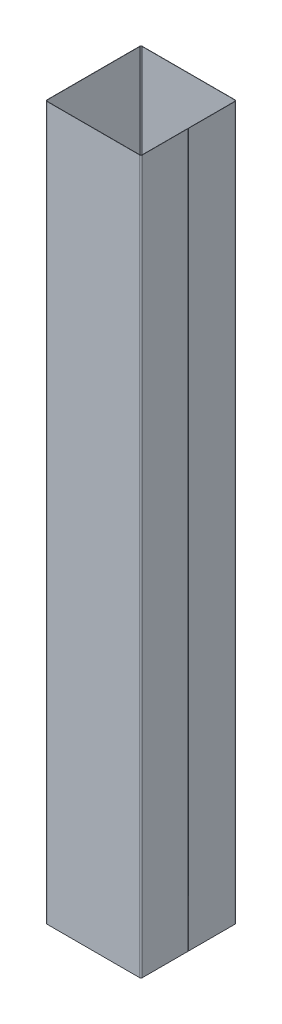
ISO-10303-21;
HEADER;
FILE_DESCRIPTION(('STEP AP214'),'2;1');
FILE_NAME('part.step','',(''),(''),'','','');
FILE_SCHEMA(('AUTOMOTIVE_DESIGN { 1 0 10303 214 1 1 1 1 }'));
ENDSEC;
DATA;
#1=APPLICATION_CONTEXT('core data for automotive mechanical design processes');
#2=APPLICATION_PROTOCOL_DEFINITION('international standard','automotive_design',2000,#1);
#3=PRODUCT_CONTEXT('',#1,'mechanical');
#4=PRODUCT('Part','Part','',(#3));
#5=PRODUCT_RELATED_PRODUCT_CATEGORY('part','',(#4));
#6=PRODUCT_DEFINITION_FORMATION('','',#4);
#7=PRODUCT_DEFINITION_CONTEXT('part definition',#1,'design');
#8=PRODUCT_DEFINITION('design','',#6,#7);
#9=PRODUCT_DEFINITION_SHAPE('','',#8);
#10=(LENGTH_UNIT() NAMED_UNIT(*) SI_UNIT(.MILLI.,.METRE.));
#11=(NAMED_UNIT(*) PLANE_ANGLE_UNIT() SI_UNIT($,.RADIAN.));
#12=(NAMED_UNIT(*) SI_UNIT($,.STERADIAN.) SOLID_ANGLE_UNIT());
#13=UNCERTAINTY_MEASURE_WITH_UNIT(LENGTH_MEASURE(1.E-05),#10,'distance_accuracy_value','');
#14=(GEOMETRIC_REPRESENTATION_CONTEXT(3) GLOBAL_UNCERTAINTY_ASSIGNED_CONTEXT((#13)) GLOBAL_UNIT_ASSIGNED_CONTEXT((#10,
#11,#12)) REPRESENTATION_CONTEXT('',''));
#15=CARTESIAN_POINT('',(0.,0.,0.));
#16=DIRECTION('',(0.,0.,1.));
#17=DIRECTION('',(1.,0.,0.));
#18=AXIS2_PLACEMENT_3D('',#15,#16,#17);
#19=CARTESIAN_POINT('',(39.,600.,-40.));
#20=DIRECTION('',(0.,1.,0.));
#21=DIRECTION('',(0.,0.,1.));
#22=AXIS2_PLACEMENT_3D('',#19,#20,#21);
#23=PLANE('',#22);
#24=DIRECTION('',(0.,0.,-1.));
#25=VECTOR('',#24,1.);
#26=CARTESIAN_POINT('',(39.,600.,-40.));
#27=LINE('',#26,#25);
#28=CARTESIAN_POINT('',(39.,600.,-40.));
#29=VERTEX_POINT('',#28);
#30=CARTESIAN_POINT('',(39.,600.,-40.2));
#31=VERTEX_POINT('',#30);
#32=EDGE_CURVE('E11',#29,#31,#27,.T.);
#33=ORIENTED_EDGE('',*,*,#32,.F.);
#34=CARTESIAN_POINT('',(39.,600.,-39.));
#35=DIRECTION('',(0.,-1.,0.));
#36=DIRECTION('',(0.,0.,-1.));
#37=AXIS2_PLACEMENT_3D('',#34,#35,#36);
#38=CIRCLE('',#37,1.);
#39=CARTESIAN_POINT('',(40.,600.,-39.));
#40=VERTEX_POINT('',#39);
#41=EDGE_CURVE('E219',#29,#40,#38,.T.);
#42=ORIENTED_EDGE('',*,*,#41,.T.);
#43=DIRECTION('',(-1.,0.,0.));
#44=VECTOR('',#43,1.);
#45=CARTESIAN_POINT('',(40.2,600.,-39.));
#46=LINE('',#45,#44);
#47=CARTESIAN_POINT('',(40.2,600.,-39.));
#48=VERTEX_POINT('',#47);
#49=EDGE_CURVE('E46',#48,#40,#46,.T.);
#50=ORIENTED_EDGE('',*,*,#49,.F.);
#51=CARTESIAN_POINT('',(39.,600.,-39.));
#52=DIRECTION('',(0.,1.,0.));
#53=DIRECTION('',(1.,0.,0.));
#54=AXIS2_PLACEMENT_3D('',#51,#52,#53);
#55=CIRCLE('',#54,1.2);
#56=EDGE_CURVE('E359',#31,#48,#55,.F.);
#57=ORIENTED_EDGE('',*,*,#56,.F.);
#58=EDGE_LOOP('',(#33,#42,#50,#57));
#59=FACE_BOUND('',#58,.T.);
#60=ADVANCED_FACE('F38',(#59),#23,.T.);
#61=CARTESIAN_POINT('',(40.2,600.,-39.));
#62=DIRECTION('',(0.,1.,0.));
#63=DIRECTION('',(0.,0.,1.));
#64=AXIS2_PLACEMENT_3D('',#61,#62,#63);
#65=PLANE('',#64);
#66=DIRECTION('',(1.,0.,0.));
#67=VECTOR('',#66,1.);
#68=CARTESIAN_POINT('',(-40.,600.,-40.));
#69=LINE('',#68,#67);
#70=CARTESIAN_POINT('',(-39.,600.,-40.));
#71=VERTEX_POINT('',#70);
#72=EDGE_CURVE('E186',#71,#29,#69,.T.);
#73=ORIENTED_EDGE('',*,*,#72,.T.);
#74=ORIENTED_EDGE('',*,*,#32,.T.);
#75=DIRECTION('',(1.,0.,0.));
#76=VECTOR('',#75,1.);
#77=CARTESIAN_POINT('',(-40.,600.,-40.2));
#78=LINE('',#77,#76);
#79=CARTESIAN_POINT('',(-39.,600.,-40.2));
#80=VERTEX_POINT('',#79);
#81=EDGE_CURVE('E189',#80,#31,#78,.T.);
#82=ORIENTED_EDGE('',*,*,#81,.F.);
#83=DIRECTION('',(0.,0.,1.));
#84=VECTOR('',#83,1.);
#85=CARTESIAN_POINT('',(-39.,600.,-40.2));
#86=LINE('',#85,#84);
#87=EDGE_CURVE('E182',#80,#71,#86,.T.);
#88=ORIENTED_EDGE('',*,*,#87,.T.);
#89=EDGE_LOOP('',(#73,#74,#82,#88));
#90=FACE_BOUND('',#89,.T.);
#91=ADVANCED_FACE('F184',(#90),#65,.T.);
#92=CARTESIAN_POINT('',(40.,0.,-39.));
#93=DIRECTION('',(0.,-1.,0.));
#94=DIRECTION('',(0.,0.,-1.));
#95=AXIS2_PLACEMENT_3D('',#92,#93,#94);
#96=PLANE('',#95);
#97=DIRECTION('',(1.,0.,0.));
#98=VECTOR('',#97,1.);
#99=CARTESIAN_POINT('',(40.,0.,-39.));
#100=LINE('',#99,#98);
#101=CARTESIAN_POINT('',(40.,0.,-39.));
#102=VERTEX_POINT('',#101);
#103=CARTESIAN_POINT('',(40.2,0.,-39.));
#104=VERTEX_POINT('',#103);
#105=EDGE_CURVE('E125',#102,#104,#100,.T.);
#106=ORIENTED_EDGE('',*,*,#105,.F.);
#107=CARTESIAN_POINT('',(39.,0.,-39.));
#108=DIRECTION('',(0.,-1.,0.));
#109=DIRECTION('',(0.,0.,-1.));
#110=AXIS2_PLACEMENT_3D('',#107,#108,#109);
#111=CIRCLE('',#110,1.);
#112=CARTESIAN_POINT('',(39.,0.,-40.));
#113=VERTEX_POINT('',#112);
#114=EDGE_CURVE('E277',#113,#102,#111,.T.);
#115=ORIENTED_EDGE('',*,*,#114,.F.);
#116=DIRECTION('',(0.,0.,1.));
#117=VECTOR('',#116,1.);
#118=CARTESIAN_POINT('',(39.,0.,-40.2));
#119=LINE('',#118,#117);
#120=CARTESIAN_POINT('',(39.,0.,-40.2));
#121=VERTEX_POINT('',#120);
#122=EDGE_CURVE('E118',#121,#113,#119,.T.);
#123=ORIENTED_EDGE('',*,*,#122,.F.);
#124=CARTESIAN_POINT('',(39.,0.,-39.));
#125=DIRECTION('',(0.,1.,0.));
#126=DIRECTION('',(1.,0.,0.));
#127=AXIS2_PLACEMENT_3D('',#124,#125,#126);
#128=CIRCLE('',#127,1.2);
#129=EDGE_CURVE('E234',#121,#104,#128,.F.);
#130=ORIENTED_EDGE('',*,*,#129,.T.);
#131=EDGE_LOOP('',(#106,#115,#123,#130));
#132=FACE_BOUND('',#131,.T.);
#133=ADVANCED_FACE('F364',(#132),#96,.T.);
#134=CARTESIAN_POINT('',(39.,0.,-40.2));
#135=DIRECTION('',(0.,-1.,0.));
#136=DIRECTION('',(0.,0.,-1.));
#137=AXIS2_PLACEMENT_3D('',#134,#135,#136);
#138=PLANE('',#137);
#139=DIRECTION('',(0.,0.,1.));
#140=VECTOR('',#139,1.);
#141=CARTESIAN_POINT('',(40.,0.,-40.));
#142=LINE('',#141,#140);
#143=CARTESIAN_POINT('',(40.,0.,0.));
#144=VERTEX_POINT('',#143);
#145=EDGE_CURVE('E225',#102,#144,#142,.T.);
#146=ORIENTED_EDGE('',*,*,#145,.F.);
#147=ORIENTED_EDGE('',*,*,#105,.T.);
#148=DIRECTION('',(0.,0.,-1.));
#149=VECTOR('',#148,1.);
#150=CARTESIAN_POINT('',(40.2,0.,-40.));
#151=LINE('',#150,#149);
#152=CARTESIAN_POINT('',(40.2,0.,0.));
#153=VERTEX_POINT('',#152);
#154=EDGE_CURVE('E231',#104,#153,#151,.F.);
#155=ORIENTED_EDGE('',*,*,#154,.T.);
#156=DIRECTION('',(-1.,0.,0.));
#157=VECTOR('',#156,1.);
#158=CARTESIAN_POINT('',(40.2,0.,0.));
#159=LINE('',#158,#157);
#160=EDGE_CURVE('E228',#153,#144,#159,.T.);
#161=ORIENTED_EDGE('',*,*,#160,.T.);
#162=EDGE_LOOP('',(#146,#147,#155,#161));
#163=FACE_BOUND('',#162,.T.);
#164=ADVANCED_FACE('F350',(#163),#138,.T.);
#165=CARTESIAN_POINT('',(-40.,600.,-39.));
#166=DIRECTION('',(0.,1.,0.));
#167=DIRECTION('',(0.,0.,1.));
#168=AXIS2_PLACEMENT_3D('',#165,#166,#167);
#169=PLANE('',#168);
#170=DIRECTION('',(-1.,0.,0.));
#171=VECTOR('',#170,1.);
#172=CARTESIAN_POINT('',(-40.,600.,-39.));
#173=LINE('',#172,#171);
#174=CARTESIAN_POINT('',(-40.,600.,-39.));
#175=VERTEX_POINT('',#174);
#176=CARTESIAN_POINT('',(-40.2,600.,-39.));
#177=VERTEX_POINT('',#176);
#178=EDGE_CURVE('E194',#175,#177,#173,.T.);
#179=ORIENTED_EDGE('',*,*,#178,.F.);
#180=CARTESIAN_POINT('',(-39.,600.,-39.));
#181=DIRECTION('',(0.,-1.,0.));
#182=DIRECTION('',(0.,0.,-1.));
#183=AXIS2_PLACEMENT_3D('',#180,#181,#182);
#184=CIRCLE('',#183,1.);
#185=EDGE_CURVE('E198',#175,#71,#184,.T.);
#186=ORIENTED_EDGE('',*,*,#185,.T.);
#187=ORIENTED_EDGE('',*,*,#87,.F.);
#188=CARTESIAN_POINT('',(-39.,600.,-39.));
#189=DIRECTION('',(0.,1.,0.));
#190=DIRECTION('',(1.,0.,0.));
#191=AXIS2_PLACEMENT_3D('',#188,#189,#190);
#192=CIRCLE('',#191,1.2);
#193=EDGE_CURVE('E371',#177,#80,#192,.F.);
#194=ORIENTED_EDGE('',*,*,#193,.F.);
#195=EDGE_LOOP('',(#179,#186,#187,#194));
#196=FACE_BOUND('',#195,.T.);
#197=ADVANCED_FACE('F200',(#196),#169,.T.);
#198=CARTESIAN_POINT('',(-39.,600.,-40.2));
#199=DIRECTION('',(0.,1.,0.));
#200=DIRECTION('',(0.,0.,1.));
#201=AXIS2_PLACEMENT_3D('',#198,#199,#200);
#202=PLANE('',#201);
#203=DIRECTION('',(0.,0.,-1.));
#204=VECTOR('',#203,1.);
#205=CARTESIAN_POINT('',(-40.,600.,-40.));
#206=LINE('',#205,#204);
#207=CARTESIAN_POINT('',(-40.,600.,39.));
#208=VERTEX_POINT('',#207);
#209=EDGE_CURVE('E204',#208,#175,#206,.T.);
#210=ORIENTED_EDGE('',*,*,#209,.T.);
#211=ORIENTED_EDGE('',*,*,#178,.T.);
#212=DIRECTION('',(0.,0.,-1.));
#213=VECTOR('',#212,1.);
#214=CARTESIAN_POINT('',(-40.2,600.,-40.));
#215=LINE('',#214,#213);
#216=CARTESIAN_POINT('',(-40.2,600.,39.));
#217=VERTEX_POINT('',#216);
#218=EDGE_CURVE('E378',#217,#177,#215,.T.);
#219=ORIENTED_EDGE('',*,*,#218,.F.);
#220=DIRECTION('',(1.,0.,0.));
#221=VECTOR('',#220,1.);
#222=CARTESIAN_POINT('',(-40.2,600.,39.));
#223=LINE('',#222,#221);
#224=EDGE_CURVE('E339',#217,#208,#223,.T.);
#225=ORIENTED_EDGE('',*,*,#224,.T.);
#226=EDGE_LOOP('',(#210,#211,#219,#225));
#227=FACE_BOUND('',#226,.T.);
#228=ADVANCED_FACE('F410',(#227),#202,.T.);
#229=CARTESIAN_POINT('',(-39.,0.,-40.));
#230=DIRECTION('',(0.,-1.,0.));
#231=DIRECTION('',(0.,0.,-1.));
#232=AXIS2_PLACEMENT_3D('',#229,#230,#231);
#233=PLANE('',#232);
#234=DIRECTION('',(0.,0.,-1.));
#235=VECTOR('',#234,1.);
#236=CARTESIAN_POINT('',(-39.,0.,-40.));
#237=LINE('',#236,#235);
#238=CARTESIAN_POINT('',(-39.,0.,-40.));
#239=VERTEX_POINT('',#238);
#240=CARTESIAN_POINT('',(-39.,0.,-40.2));
#241=VERTEX_POINT('',#240);
#242=EDGE_CURVE('E195',#239,#241,#237,.T.);
#243=ORIENTED_EDGE('',*,*,#242,.F.);
#244=CARTESIAN_POINT('',(-39.,0.,-39.));
#245=DIRECTION('',(0.,-1.,0.));
#246=DIRECTION('',(0.,0.,-1.));
#247=AXIS2_PLACEMENT_3D('',#244,#245,#246);
#248=CIRCLE('',#247,1.);
#249=CARTESIAN_POINT('',(-40.,0.,-39.));
#250=VERTEX_POINT('',#249);
#251=EDGE_CURVE('E211',#250,#239,#248,.T.);
#252=ORIENTED_EDGE('',*,*,#251,.F.);
#253=DIRECTION('',(1.,0.,0.));
#254=VECTOR('',#253,1.);
#255=CARTESIAN_POINT('',(-40.2,0.,-39.));
#256=LINE('',#255,#254);
#257=CARTESIAN_POINT('',(-40.2,0.,-39.));
#258=VERTEX_POINT('',#257);
#259=EDGE_CURVE('E343',#258,#250,#256,.T.);
#260=ORIENTED_EDGE('',*,*,#259,.F.);
#261=CARTESIAN_POINT('',(-39.,0.,-39.));
#262=DIRECTION('',(0.,1.,0.));
#263=DIRECTION('',(1.,0.,0.));
#264=AXIS2_PLACEMENT_3D('',#261,#262,#263);
#265=CIRCLE('',#264,1.2);
#266=EDGE_CURVE('E238',#258,#241,#265,.F.);
#267=ORIENTED_EDGE('',*,*,#266,.T.);
#268=EDGE_LOOP('',(#243,#252,#260,#267));
#269=FACE_BOUND('',#268,.T.);
#270=ADVANCED_FACE('F417',(#269),#233,.T.);
#271=CARTESIAN_POINT('',(-40.2,0.,-39.));
#272=DIRECTION('',(0.,-1.,0.));
#273=DIRECTION('',(0.,0.,-1.));
#274=AXIS2_PLACEMENT_3D('',#271,#272,#273);
#275=PLANE('',#274);
#276=DIRECTION('',(1.,0.,0.));
#277=VECTOR('',#276,1.);
#278=CARTESIAN_POINT('',(-40.,0.,-40.));
#279=LINE('',#278,#277);
#280=EDGE_CURVE('E275',#239,#113,#279,.T.);
#281=ORIENTED_EDGE('',*,*,#280,.F.);
#282=ORIENTED_EDGE('',*,*,#242,.T.);
#283=DIRECTION('',(1.,0.,0.));
#284=VECTOR('',#283,1.);
#285=CARTESIAN_POINT('',(-40.,0.,-40.2));
#286=LINE('',#285,#284);
#287=EDGE_CURVE('E236',#241,#121,#286,.T.);
#288=ORIENTED_EDGE('',*,*,#287,.T.);
#289=ORIENTED_EDGE('',*,*,#122,.T.);
#290=EDGE_LOOP('',(#281,#282,#288,#289));
#291=FACE_BOUND('',#290,.T.);
#292=ADVANCED_FACE('F419',(#291),#275,.T.);
#293=CARTESIAN_POINT('',(-39.,600.,40.));
#294=DIRECTION('',(0.,1.,0.));
#295=DIRECTION('',(0.,0.,1.));
#296=AXIS2_PLACEMENT_3D('',#293,#294,#295);
#297=PLANE('',#296);
#298=DIRECTION('',(0.,0.,1.));
#299=VECTOR('',#298,1.);
#300=CARTESIAN_POINT('',(-39.,600.,40.));
#301=LINE('',#300,#299);
#302=CARTESIAN_POINT('',(-39.,600.,40.));
#303=VERTEX_POINT('',#302);
#304=CARTESIAN_POINT('',(-39.,600.,40.2));
#305=VERTEX_POINT('',#304);
#306=EDGE_CURVE('E341',#303,#305,#301,.T.);
#307=ORIENTED_EDGE('',*,*,#306,.F.);
#308=CARTESIAN_POINT('',(-39.,600.,39.));
#309=DIRECTION('',(0.,-1.,0.));
#310=DIRECTION('',(0.,0.,-1.));
#311=AXIS2_PLACEMENT_3D('',#308,#309,#310);
#312=CIRCLE('',#311,1.);
#313=EDGE_CURVE('E405',#303,#208,#312,.T.);
#314=ORIENTED_EDGE('',*,*,#313,.T.);
#315=ORIENTED_EDGE('',*,*,#224,.F.);
#316=CARTESIAN_POINT('',(-39.,600.,39.));
#317=DIRECTION('',(0.,1.,0.));
#318=DIRECTION('',(1.,0.,0.));
#319=AXIS2_PLACEMENT_3D('',#316,#317,#318);
#320=CIRCLE('',#319,1.2);
#321=EDGE_CURVE('E381',#305,#217,#320,.F.);
#322=ORIENTED_EDGE('',*,*,#321,.F.);
#323=EDGE_LOOP('',(#307,#314,#315,#322));
#324=FACE_BOUND('',#323,.T.);
#325=ADVANCED_FACE('F432',(#324),#297,.T.);
#326=CARTESIAN_POINT('',(-40.2,600.,39.));
#327=DIRECTION('',(0.,1.,0.));
#328=DIRECTION('',(0.,0.,1.));
#329=AXIS2_PLACEMENT_3D('',#326,#327,#328);
#330=PLANE('',#329);
#331=DIRECTION('',(-1.,0.,0.));
#332=VECTOR('',#331,1.);
#333=CARTESIAN_POINT('',(-40.,600.,40.));
#334=LINE('',#333,#332);
#335=CARTESIAN_POINT('',(39.,600.,40.));
#336=VERTEX_POINT('',#335);
#337=EDGE_CURVE('E402',#336,#303,#334,.T.);
#338=ORIENTED_EDGE('',*,*,#337,.T.);
#339=ORIENTED_EDGE('',*,*,#306,.T.);
#340=DIRECTION('',(1.,0.,0.));
#341=VECTOR('',#340,1.);
#342=CARTESIAN_POINT('',(-40.,600.,40.2));
#343=LINE('',#342,#341);
#344=CARTESIAN_POINT('',(39.,600.,40.2));
#345=VERTEX_POINT('',#344);
#346=EDGE_CURVE('E384',#345,#305,#343,.F.);
#347=ORIENTED_EDGE('',*,*,#346,.F.);
#348=DIRECTION('',(0.,0.,-1.));
#349=VECTOR('',#348,1.);
#350=CARTESIAN_POINT('',(39.,600.,40.2));
#351=LINE('',#350,#349);
#352=EDGE_CURVE('E331',#345,#336,#351,.T.);
#353=ORIENTED_EDGE('',*,*,#352,.T.);
#354=EDGE_LOOP('',(#338,#339,#347,#353));
#355=FACE_BOUND('',#354,.T.);
#356=ADVANCED_FACE('F439',(#355),#330,.T.);
#357=CARTESIAN_POINT('',(-40.,0.,39.));
#358=DIRECTION('',(0.,-1.,0.));
#359=DIRECTION('',(0.,0.,-1.));
#360=AXIS2_PLACEMENT_3D('',#357,#358,#359);
#361=PLANE('',#360);
#362=DIRECTION('',(-1.,0.,0.));
#363=VECTOR('',#362,1.);
#364=CARTESIAN_POINT('',(-40.,0.,39.));
#365=LINE('',#364,#363);
#366=CARTESIAN_POINT('',(-40.,0.,39.));
#367=VERTEX_POINT('',#366);
#368=CARTESIAN_POINT('',(-40.2,0.,39.));
#369=VERTEX_POINT('',#368);
#370=EDGE_CURVE('E337',#367,#369,#365,.T.);
#371=ORIENTED_EDGE('',*,*,#370,.F.);
#372=CARTESIAN_POINT('',(-39.,0.,39.));
#373=DIRECTION('',(0.,-1.,0.));
#374=DIRECTION('',(0.,0.,-1.));
#375=AXIS2_PLACEMENT_3D('',#372,#373,#374);
#376=CIRCLE('',#375,1.);
#377=CARTESIAN_POINT('',(-39.,0.,40.));
#378=VERTEX_POINT('',#377);
#379=EDGE_CURVE('E268',#378,#367,#376,.T.);
#380=ORIENTED_EDGE('',*,*,#379,.F.);
#381=DIRECTION('',(0.,0.,-1.));
#382=VECTOR('',#381,1.);
#383=CARTESIAN_POINT('',(-39.,0.,40.2));
#384=LINE('',#383,#382);
#385=CARTESIAN_POINT('',(-39.,0.,40.2));
#386=VERTEX_POINT('',#385);
#387=EDGE_CURVE('E335',#386,#378,#384,.T.);
#388=ORIENTED_EDGE('',*,*,#387,.F.);
#389=CARTESIAN_POINT('',(-39.,0.,39.));
#390=DIRECTION('',(0.,1.,0.));
#391=DIRECTION('',(1.,0.,0.));
#392=AXIS2_PLACEMENT_3D('',#389,#390,#391);
#393=CIRCLE('',#392,1.2);
#394=EDGE_CURVE('E244',#386,#369,#393,.F.);
#395=ORIENTED_EDGE('',*,*,#394,.T.);
#396=EDGE_LOOP('',(#371,#380,#388,#395));
#397=FACE_BOUND('',#396,.T.);
#398=ADVANCED_FACE('F480',(#397),#361,.T.);
#399=CARTESIAN_POINT('',(-39.,0.,40.2));
#400=DIRECTION('',(0.,-1.,0.));
#401=DIRECTION('',(0.,0.,-1.));
#402=AXIS2_PLACEMENT_3D('',#399,#400,#401);
#403=PLANE('',#402);
#404=DIRECTION('',(0.,0.,-1.));
#405=VECTOR('',#404,1.);
#406=CARTESIAN_POINT('',(-40.,0.,-40.));
#407=LINE('',#406,#405);
#408=EDGE_CURVE('E271',#367,#250,#407,.T.);
#409=ORIENTED_EDGE('',*,*,#408,.F.);
#410=ORIENTED_EDGE('',*,*,#370,.T.);
#411=DIRECTION('',(0.,0.,-1.));
#412=VECTOR('',#411,1.);
#413=CARTESIAN_POINT('',(-40.2,0.,-40.));
#414=LINE('',#413,#412);
#415=EDGE_CURVE('E241',#369,#258,#414,.T.);
#416=ORIENTED_EDGE('',*,*,#415,.T.);
#417=ORIENTED_EDGE('',*,*,#259,.T.);
#418=EDGE_LOOP('',(#409,#410,#416,#417));
#419=FACE_BOUND('',#418,.T.);
#420=ADVANCED_FACE('F478',(#419),#403,.T.);
#421=CARTESIAN_POINT('',(40.,600.,39.));
#422=DIRECTION('',(0.,1.,0.));
#423=DIRECTION('',(0.,0.,1.));
#424=AXIS2_PLACEMENT_3D('',#421,#422,#423);
#425=PLANE('',#424);
#426=DIRECTION('',(1.,0.,0.));
#427=VECTOR('',#426,1.);
#428=CARTESIAN_POINT('',(40.,600.,39.));
#429=LINE('',#428,#427);
#430=CARTESIAN_POINT('',(40.,600.,39.));
#431=VERTEX_POINT('',#430);
#432=CARTESIAN_POINT('',(40.2,600.,39.));
#433=VERTEX_POINT('',#432);
#434=EDGE_CURVE('E333',#431,#433,#429,.T.);
#435=ORIENTED_EDGE('',*,*,#434,.F.);
#436=CARTESIAN_POINT('',(39.,600.,39.));
#437=DIRECTION('',(0.,-1.,0.));
#438=DIRECTION('',(0.,0.,-1.));
#439=AXIS2_PLACEMENT_3D('',#436,#437,#438);
#440=CIRCLE('',#439,1.);
#441=EDGE_CURVE('E399',#431,#336,#440,.T.);
#442=ORIENTED_EDGE('',*,*,#441,.T.);
#443=ORIENTED_EDGE('',*,*,#352,.F.);
#444=CARTESIAN_POINT('',(39.,600.,39.));
#445=DIRECTION('',(0.,1.,0.));
#446=DIRECTION('',(1.,0.,0.));
#447=AXIS2_PLACEMENT_3D('',#444,#445,#446);
#448=CIRCLE('',#447,1.2);
#449=EDGE_CURVE('E387',#433,#345,#448,.F.);
#450=ORIENTED_EDGE('',*,*,#449,.F.);
#451=EDGE_LOOP('',(#435,#442,#443,#450));
#452=FACE_BOUND('',#451,.T.);
#453=ADVANCED_FACE('F446',(#452),#425,.T.);
#454=CARTESIAN_POINT('',(39.,600.,40.2));
#455=DIRECTION('',(0.,1.,0.));
#456=DIRECTION('',(0.,0.,1.));
#457=AXIS2_PLACEMENT_3D('',#454,#455,#456);
#458=PLANE('',#457);
#459=DIRECTION('',(0.,0.,1.));
#460=VECTOR('',#459,1.);
#461=CARTESIAN_POINT('',(40.,600.,0.500000000000007));
#462=LINE('',#461,#460);
#463=CARTESIAN_POINT('',(40.,600.,0.500000000000007));
#464=VERTEX_POINT('',#463);
#465=EDGE_CURVE('E396',#464,#431,#462,.T.);
#466=ORIENTED_EDGE('',*,*,#465,.T.);
#467=ORIENTED_EDGE('',*,*,#434,.T.);
#468=DIRECTION('',(0.,0.,1.));
#469=VECTOR('',#468,1.);
#470=CARTESIAN_POINT('',(40.2,600.,0.500000000000007));
#471=LINE('',#470,#469);
#472=CARTESIAN_POINT('',(40.2,600.,0.500000000000007));
#473=VERTEX_POINT('',#472);
#474=EDGE_CURVE('E390',#473,#433,#471,.T.);
#475=ORIENTED_EDGE('',*,*,#474,.F.);
#476=DIRECTION('',(1.,0.,0.));
#477=VECTOR('',#476,1.);
#478=CARTESIAN_POINT('',(40.,600.,0.500000000000007));
#479=LINE('',#478,#477);
#480=EDGE_CURVE('E393',#464,#473,#479,.T.);
#481=ORIENTED_EDGE('',*,*,#480,.F.);
#482=EDGE_LOOP('',(#466,#467,#475,#481));
#483=FACE_BOUND('',#482,.T.);
#484=ADVANCED_FACE('F453',(#483),#458,.T.);
#485=CARTESIAN_POINT('',(39.,0.,40.));
#486=DIRECTION('',(0.,-1.,0.));
#487=DIRECTION('',(0.,0.,-1.));
#488=AXIS2_PLACEMENT_3D('',#485,#486,#487);
#489=PLANE('',#488);
#490=DIRECTION('',(0.,0.,1.));
#491=VECTOR('',#490,1.);
#492=CARTESIAN_POINT('',(39.,0.,40.));
#493=LINE('',#492,#491);
#494=CARTESIAN_POINT('',(39.,0.,40.));
#495=VERTEX_POINT('',#494);
#496=CARTESIAN_POINT('',(39.,0.,40.2));
#497=VERTEX_POINT('',#496);
#498=EDGE_CURVE('E329',#495,#497,#493,.T.);
#499=ORIENTED_EDGE('',*,*,#498,.F.);
#500=CARTESIAN_POINT('',(39.,0.,39.));
#501=DIRECTION('',(0.,-1.,0.));
#502=DIRECTION('',(0.,0.,-1.));
#503=AXIS2_PLACEMENT_3D('',#500,#501,#502);
#504=CIRCLE('',#503,1.);
#505=CARTESIAN_POINT('',(40.,0.,39.));
#506=VERTEX_POINT('',#505);
#507=EDGE_CURVE('E262',#506,#495,#504,.T.);
#508=ORIENTED_EDGE('',*,*,#507,.F.);
#509=DIRECTION('',(-1.,0.,0.));
#510=VECTOR('',#509,1.);
#511=CARTESIAN_POINT('',(40.2,0.,39.));
#512=LINE('',#511,#510);
#513=CARTESIAN_POINT('',(40.2,0.,39.));
#514=VERTEX_POINT('',#513);
#515=EDGE_CURVE('E327',#514,#506,#512,.T.);
#516=ORIENTED_EDGE('',*,*,#515,.F.);
#517=CARTESIAN_POINT('',(39.,0.,39.));
#518=DIRECTION('',(0.,1.,0.));
#519=DIRECTION('',(1.,0.,0.));
#520=AXIS2_PLACEMENT_3D('',#517,#518,#519);
#521=CIRCLE('',#520,1.2);
#522=EDGE_CURVE('E250',#514,#497,#521,.F.);
#523=ORIENTED_EDGE('',*,*,#522,.T.);
#524=EDGE_LOOP('',(#499,#508,#516,#523));
#525=FACE_BOUND('',#524,.T.);
#526=ADVANCED_FACE('F484',(#525),#489,.T.);
#527=CARTESIAN_POINT('',(40.2,0.,39.));
#528=DIRECTION('',(0.,-1.,0.));
#529=DIRECTION('',(0.,0.,-1.));
#530=AXIS2_PLACEMENT_3D('',#527,#528,#529);
#531=PLANE('',#530);
#532=DIRECTION('',(-1.,0.,0.));
#533=VECTOR('',#532,1.);
#534=CARTESIAN_POINT('',(-40.,0.,40.));
#535=LINE('',#534,#533);
#536=EDGE_CURVE('E265',#495,#378,#535,.T.);
#537=ORIENTED_EDGE('',*,*,#536,.F.);
#538=ORIENTED_EDGE('',*,*,#498,.T.);
#539=DIRECTION('',(1.,0.,0.));
#540=VECTOR('',#539,1.);
#541=CARTESIAN_POINT('',(-40.,0.,40.2));
#542=LINE('',#541,#540);
#543=EDGE_CURVE('E247',#497,#386,#542,.F.);
#544=ORIENTED_EDGE('',*,*,#543,.T.);
#545=ORIENTED_EDGE('',*,*,#387,.T.);
#546=EDGE_LOOP('',(#537,#538,#544,#545));
#547=FACE_BOUND('',#546,.T.);
#548=ADVANCED_FACE('F482',(#547),#531,.T.);
#549=CARTESIAN_POINT('',(40.,600.,-40.));
#550=DIRECTION('',(1.,0.,0.));
#551=DIRECTION('',(0.,0.,-1.));
#552=AXIS2_PLACEMENT_3D('',#549,#550,#551);
#553=PLANE('',#552);
#554=ORIENTED_EDGE('',*,*,#145,.T.);
#555=DIRECTION('',(0.,-1.,0.));
#556=VECTOR('',#555,1.);
#557=CARTESIAN_POINT('',(40.,600.,0.));
#558=LINE('',#557,#556);
#559=CARTESIAN_POINT('',(40.,600.,0.));
#560=VERTEX_POINT('',#559);
#561=EDGE_CURVE('E325',#560,#144,#558,.T.);
#562=ORIENTED_EDGE('',*,*,#561,.F.);
#563=DIRECTION('',(0.,0.,1.));
#564=VECTOR('',#563,1.);
#565=CARTESIAN_POINT('',(40.,600.,-40.));
#566=LINE('',#565,#564);
#567=EDGE_CURVE('E131',#40,#560,#566,.T.);
#568=ORIENTED_EDGE('',*,*,#567,.F.);
#569=DIRECTION('',(0.,-1.,0.));
#570=VECTOR('',#569,1.);
#571=CARTESIAN_POINT('',(40.,600.,-39.));
#572=LINE('',#571,#570);
#573=EDGE_CURVE('E221',#40,#102,#572,.T.);
#574=ORIENTED_EDGE('',*,*,#573,.T.);
#575=EDGE_LOOP('',(#554,#562,#568,#574));
#576=FACE_BOUND('',#575,.T.);
#577=ADVANCED_FACE('F531',(#576),#553,.F.);
#578=CARTESIAN_POINT('',(40.2,600.,0.));
#579=DIRECTION('',(0.,0.,1.));
#580=DIRECTION('',(1.,0.,0.));
#581=AXIS2_PLACEMENT_3D('',#578,#579,#580);
#582=PLANE('',#581);
#583=ORIENTED_EDGE('',*,*,#160,.F.);
#584=DIRECTION('',(0.,-1.,0.));
#585=VECTOR('',#584,1.);
#586=CARTESIAN_POINT('',(40.2,600.,0.));
#587=LINE('',#586,#585);
#588=CARTESIAN_POINT('',(40.2,600.,0.));
#589=VERTEX_POINT('',#588);
#590=EDGE_CURVE('E323',#589,#153,#587,.T.);
#591=ORIENTED_EDGE('',*,*,#590,.F.);
#592=DIRECTION('',(-1.,0.,0.));
#593=VECTOR('',#592,1.);
#594=CARTESIAN_POINT('',(40.2,600.,0.));
#595=LINE('',#594,#593);
#596=EDGE_CURVE('E373',#589,#560,#595,.T.);
#597=ORIENTED_EDGE('',*,*,#596,.T.);
#598=ORIENTED_EDGE('',*,*,#561,.T.);
#599=EDGE_LOOP('',(#583,#591,#597,#598));
#600=FACE_BOUND('',#599,.T.);
#601=ADVANCED_FACE('F534',(#600),#582,.T.);
#602=CARTESIAN_POINT('',(40.2,600.,-40.));
#603=DIRECTION('',(1.,0.,0.));
#604=DIRECTION('',(0.,0.,-1.));
#605=AXIS2_PLACEMENT_3D('',#602,#603,#604);
#606=PLANE('',#605);
#607=ORIENTED_EDGE('',*,*,#154,.F.);
#608=DIRECTION('',(0.,-1.,0.));
#609=VECTOR('',#608,1.);
#610=CARTESIAN_POINT('',(40.2,600.,-39.));
#611=LINE('',#610,#609);
#612=EDGE_CURVE('E320',#48,#104,#611,.T.);
#613=ORIENTED_EDGE('',*,*,#612,.F.);
#614=DIRECTION('',(0.,0.,-1.));
#615=VECTOR('',#614,1.);
#616=CARTESIAN_POINT('',(40.2,600.,-40.));
#617=LINE('',#616,#615);
#618=EDGE_CURVE('E369',#48,#589,#617,.F.);
#619=ORIENTED_EDGE('',*,*,#618,.T.);
#620=ORIENTED_EDGE('',*,*,#590,.T.);
#621=EDGE_LOOP('',(#607,#613,#619,#620));
#622=FACE_BOUND('',#621,.T.);
#623=ADVANCED_FACE('F362',(#622),#606,.T.);
#624=CARTESIAN_POINT('',(39.,600.,-39.));
#625=DIRECTION('',(0.,-1.,0.));
#626=DIRECTION('',(0.,0.,-1.));
#627=AXIS2_PLACEMENT_3D('',#624,#625,#626);
#628=CYLINDRICAL_SURFACE('',#627,1.2);
#629=ORIENTED_EDGE('',*,*,#129,.F.);
#630=DIRECTION('',(0.,-1.,0.));
#631=VECTOR('',#630,1.);
#632=CARTESIAN_POINT('',(39.,600.,-40.2));
#633=LINE('',#632,#631);
#634=EDGE_CURVE('E317',#31,#121,#633,.T.);
#635=ORIENTED_EDGE('',*,*,#634,.F.);
#636=ORIENTED_EDGE('',*,*,#56,.T.);
#637=ORIENTED_EDGE('',*,*,#612,.T.);
#638=EDGE_LOOP('',(#629,#635,#636,#637));
#639=FACE_BOUND('',#638,.T.);
#640=ADVANCED_FACE('F356',(#639),#628,.T.);
#641=CARTESIAN_POINT('',(-40.,600.,-40.2));
#642=DIRECTION('',(0.,0.,-1.));
#643=DIRECTION('',(-1.,0.,0.));
#644=AXIS2_PLACEMENT_3D('',#641,#642,#643);
#645=PLANE('',#644);
#646=ORIENTED_EDGE('',*,*,#287,.F.);
#647=DIRECTION('',(0.,-1.,0.));
#648=VECTOR('',#647,1.);
#649=CARTESIAN_POINT('',(-39.,600.,-40.2));
#650=LINE('',#649,#648);
#651=EDGE_CURVE('E314',#80,#241,#650,.T.);
#652=ORIENTED_EDGE('',*,*,#651,.F.);
#653=ORIENTED_EDGE('',*,*,#81,.T.);
#654=ORIENTED_EDGE('',*,*,#634,.T.);
#655=EDGE_LOOP('',(#646,#652,#653,#654));
#656=FACE_BOUND('',#655,.T.);
#657=ADVANCED_FACE('F367',(#656),#645,.T.);
#658=CARTESIAN_POINT('',(-39.,600.,-39.));
#659=DIRECTION('',(0.,-1.,0.));
#660=DIRECTION('',(0.,0.,-1.));
#661=AXIS2_PLACEMENT_3D('',#658,#659,#660);
#662=CYLINDRICAL_SURFACE('',#661,1.2);
#663=ORIENTED_EDGE('',*,*,#266,.F.);
#664=DIRECTION('',(0.,-1.,0.));
#665=VECTOR('',#664,1.);
#666=CARTESIAN_POINT('',(-40.2,600.,-39.));
#667=LINE('',#666,#665);
#668=EDGE_CURVE('E311',#177,#258,#667,.T.);
#669=ORIENTED_EDGE('',*,*,#668,.F.);
#670=ORIENTED_EDGE('',*,*,#193,.T.);
#671=ORIENTED_EDGE('',*,*,#651,.T.);
#672=EDGE_LOOP('',(#663,#669,#670,#671));
#673=FACE_BOUND('',#672,.T.);
#674=ADVANCED_FACE('F421',(#673),#662,.T.);
#675=CARTESIAN_POINT('',(-40.2,600.,-40.));
#676=DIRECTION('',(-1.,0.,0.));
#677=DIRECTION('',(0.,0.,1.));
#678=AXIS2_PLACEMENT_3D('',#675,#676,#677);
#679=PLANE('',#678);
#680=ORIENTED_EDGE('',*,*,#415,.F.);
#681=DIRECTION('',(0.,-1.,0.));
#682=VECTOR('',#681,1.);
#683=CARTESIAN_POINT('',(-40.2,600.,39.));
#684=LINE('',#683,#682);
#685=EDGE_CURVE('E308',#217,#369,#684,.T.);
#686=ORIENTED_EDGE('',*,*,#685,.F.);
#687=ORIENTED_EDGE('',*,*,#218,.T.);
#688=ORIENTED_EDGE('',*,*,#668,.T.);
#689=EDGE_LOOP('',(#680,#686,#687,#688));
#690=FACE_BOUND('',#689,.T.);
#691=ADVANCED_FACE('F425',(#690),#679,.T.);
#692=CARTESIAN_POINT('',(-39.,600.,39.));
#693=DIRECTION('',(0.,-1.,0.));
#694=DIRECTION('',(0.,0.,-1.));
#695=AXIS2_PLACEMENT_3D('',#692,#693,#694);
#696=CYLINDRICAL_SURFACE('',#695,1.2);
#697=ORIENTED_EDGE('',*,*,#394,.F.);
#698=DIRECTION('',(0.,-1.,0.));
#699=VECTOR('',#698,1.);
#700=CARTESIAN_POINT('',(-39.,600.,40.2));
#701=LINE('',#700,#699);
#702=EDGE_CURVE('E305',#305,#386,#701,.T.);
#703=ORIENTED_EDGE('',*,*,#702,.F.);
#704=ORIENTED_EDGE('',*,*,#321,.T.);
#705=ORIENTED_EDGE('',*,*,#685,.T.);
#706=EDGE_LOOP('',(#697,#703,#704,#705));
#707=FACE_BOUND('',#706,.T.);
#708=ADVANCED_FACE('F430',(#707),#696,.T.);
#709=CARTESIAN_POINT('',(-40.,600.,40.2));
#710=DIRECTION('',(0.,0.,1.));
#711=DIRECTION('',(1.,0.,0.));
#712=AXIS2_PLACEMENT_3D('',#709,#710,#711);
#713=PLANE('',#712);
#714=ORIENTED_EDGE('',*,*,#543,.F.);
#715=DIRECTION('',(0.,-1.,0.));
#716=VECTOR('',#715,1.);
#717=CARTESIAN_POINT('',(39.,600.,40.2));
#718=LINE('',#717,#716);
#719=EDGE_CURVE('E302',#345,#497,#718,.T.);
#720=ORIENTED_EDGE('',*,*,#719,.F.);
#721=ORIENTED_EDGE('',*,*,#346,.T.);
#722=ORIENTED_EDGE('',*,*,#702,.T.);
#723=EDGE_LOOP('',(#714,#720,#721,#722));
#724=FACE_BOUND('',#723,.T.);
#725=ADVANCED_FACE('F437',(#724),#713,.T.);
#726=CARTESIAN_POINT('',(39.,600.,39.));
#727=DIRECTION('',(0.,-1.,0.));
#728=DIRECTION('',(0.,0.,-1.));
#729=AXIS2_PLACEMENT_3D('',#726,#727,#728);
#730=CYLINDRICAL_SURFACE('',#729,1.2);
#731=ORIENTED_EDGE('',*,*,#522,.F.);
#732=DIRECTION('',(0.,-1.,0.));
#733=VECTOR('',#732,1.);
#734=CARTESIAN_POINT('',(40.2,600.,39.));
#735=LINE('',#734,#733);
#736=EDGE_CURVE('E299',#433,#514,#735,.T.);
#737=ORIENTED_EDGE('',*,*,#736,.F.);
#738=ORIENTED_EDGE('',*,*,#449,.T.);
#739=ORIENTED_EDGE('',*,*,#719,.T.);
#740=EDGE_LOOP('',(#731,#737,#738,#739));
#741=FACE_BOUND('',#740,.T.);
#742=ADVANCED_FACE('F444',(#741),#730,.T.);
#743=CARTESIAN_POINT('',(40.2,600.,0.500000000000007));
#744=DIRECTION('',(1.,0.,0.));
#745=DIRECTION('',(0.,0.,-1.));
#746=AXIS2_PLACEMENT_3D('',#743,#744,#745);
#747=PLANE('',#746);
#748=DIRECTION('',(0.,0.,1.));
#749=VECTOR('',#748,1.);
#750=CARTESIAN_POINT('',(40.2,0.,0.500000000000007));
#751=LINE('',#750,#749);
#752=CARTESIAN_POINT('',(40.2,0.,0.500000000000007));
#753=VERTEX_POINT('',#752);
#754=EDGE_CURVE('E253',#753,#514,#751,.T.);
#755=ORIENTED_EDGE('',*,*,#754,.F.);
#756=DIRECTION('',(0.,-1.,0.));
#757=VECTOR('',#756,1.);
#758=CARTESIAN_POINT('',(40.2,600.,0.500000000000007));
#759=LINE('',#758,#757);
#760=EDGE_CURVE('E297',#473,#753,#759,.T.);
#761=ORIENTED_EDGE('',*,*,#760,.F.);
#762=ORIENTED_EDGE('',*,*,#474,.T.);
#763=ORIENTED_EDGE('',*,*,#736,.T.);
#764=EDGE_LOOP('',(#755,#761,#762,#763));
#765=FACE_BOUND('',#764,.T.);
#766=ADVANCED_FACE('F450',(#765),#747,.T.);
#767=CARTESIAN_POINT('',(40.,600.,0.500000000000007));
#768=DIRECTION('',(0.,0.,-1.));
#769=DIRECTION('',(-1.,0.,0.));
#770=AXIS2_PLACEMENT_3D('',#767,#768,#769);
#771=PLANE('',#770);
#772=DIRECTION('',(1.,0.,0.));
#773=VECTOR('',#772,1.);
#774=CARTESIAN_POINT('',(40.,0.,0.500000000000007));
#775=LINE('',#774,#773);
#776=CARTESIAN_POINT('',(40.,0.,0.500000000000007));
#777=VERTEX_POINT('',#776);
#778=EDGE_CURVE('E256',#777,#753,#775,.T.);
#779=ORIENTED_EDGE('',*,*,#778,.F.);
#780=DIRECTION('',(0.,-1.,0.));
#781=VECTOR('',#780,1.);
#782=CARTESIAN_POINT('',(40.,600.,0.500000000000007));
#783=LINE('',#782,#781);
#784=EDGE_CURVE('E295',#464,#777,#783,.T.);
#785=ORIENTED_EDGE('',*,*,#784,.F.);
#786=ORIENTED_EDGE('',*,*,#480,.T.);
#787=ORIENTED_EDGE('',*,*,#760,.T.);
#788=EDGE_LOOP('',(#779,#785,#786,#787));
#789=FACE_BOUND('',#788,.T.);
#790=ADVANCED_FACE('F456',(#789),#771,.T.);
#791=CARTESIAN_POINT('',(40.,600.,0.500000000000007));
#792=DIRECTION('',(1.,0.,0.));
#793=DIRECTION('',(0.,0.,-1.));
#794=AXIS2_PLACEMENT_3D('',#791,#792,#793);
#795=PLANE('',#794);
#796=DIRECTION('',(0.,0.,1.));
#797=VECTOR('',#796,1.);
#798=CARTESIAN_POINT('',(40.,0.,0.500000000000007));
#799=LINE('',#798,#797);
#800=EDGE_CURVE('E259',#777,#506,#799,.T.);
#801=ORIENTED_EDGE('',*,*,#800,.T.);
#802=DIRECTION('',(0.,-1.,0.));
#803=VECTOR('',#802,1.);
#804=CARTESIAN_POINT('',(40.,600.,39.));
#805=LINE('',#804,#803);
#806=EDGE_CURVE('E292',#431,#506,#805,.T.);
#807=ORIENTED_EDGE('',*,*,#806,.F.);
#808=ORIENTED_EDGE('',*,*,#465,.F.);
#809=ORIENTED_EDGE('',*,*,#784,.T.);
#810=EDGE_LOOP('',(#801,#807,#808,#809));
#811=FACE_BOUND('',#810,.T.);
#812=ADVANCED_FACE('F461',(#811),#795,.F.);
#813=CARTESIAN_POINT('',(39.,600.,39.));
#814=DIRECTION('',(0.,-1.,0.));
#815=DIRECTION('',(0.,0.,-1.));
#816=AXIS2_PLACEMENT_3D('',#813,#814,#815);
#817=CYLINDRICAL_SURFACE('',#816,1.);
#818=ORIENTED_EDGE('',*,*,#507,.T.);
#819=DIRECTION('',(0.,-1.,0.));
#820=VECTOR('',#819,1.);
#821=CARTESIAN_POINT('',(39.,600.,40.));
#822=LINE('',#821,#820);
#823=EDGE_CURVE('E289',#336,#495,#822,.T.);
#824=ORIENTED_EDGE('',*,*,#823,.F.);
#825=ORIENTED_EDGE('',*,*,#441,.F.);
#826=ORIENTED_EDGE('',*,*,#806,.T.);
#827=EDGE_LOOP('',(#818,#824,#825,#826));
#828=FACE_BOUND('',#827,.T.);
#829=ADVANCED_FACE('F466',(#828),#817,.F.);
#830=CARTESIAN_POINT('',(-40.,600.,40.));
#831=DIRECTION('',(0.,0.,1.));
#832=DIRECTION('',(1.,0.,0.));
#833=AXIS2_PLACEMENT_3D('',#830,#831,#832);
#834=PLANE('',#833);
#835=ORIENTED_EDGE('',*,*,#536,.T.);
#836=DIRECTION('',(0.,-1.,0.));
#837=VECTOR('',#836,1.);
#838=CARTESIAN_POINT('',(-39.,600.,40.));
#839=LINE('',#838,#837);
#840=EDGE_CURVE('E286',#303,#378,#839,.T.);
#841=ORIENTED_EDGE('',*,*,#840,.F.);
#842=ORIENTED_EDGE('',*,*,#337,.F.);
#843=ORIENTED_EDGE('',*,*,#823,.T.);
#844=EDGE_LOOP('',(#835,#841,#842,#843));
#845=FACE_BOUND('',#844,.T.);
#846=ADVANCED_FACE('F471',(#845),#834,.F.);
#847=CARTESIAN_POINT('',(-39.,600.,39.));
#848=DIRECTION('',(0.,-1.,0.));
#849=DIRECTION('',(0.,0.,-1.));
#850=AXIS2_PLACEMENT_3D('',#847,#848,#849);
#851=CYLINDRICAL_SURFACE('',#850,1.);
#852=ORIENTED_EDGE('',*,*,#379,.T.);
#853=DIRECTION('',(0.,-1.,0.));
#854=VECTOR('',#853,1.);
#855=CARTESIAN_POINT('',(-40.,600.,39.));
#856=LINE('',#855,#854);
#857=EDGE_CURVE('E283',#208,#367,#856,.T.);
#858=ORIENTED_EDGE('',*,*,#857,.F.);
#859=ORIENTED_EDGE('',*,*,#313,.F.);
#860=ORIENTED_EDGE('',*,*,#840,.T.);
#861=EDGE_LOOP('',(#852,#858,#859,#860));
#862=FACE_BOUND('',#861,.T.);
#863=ADVANCED_FACE('F476',(#862),#851,.F.);
#864=CARTESIAN_POINT('',(-40.,600.,-40.));
#865=DIRECTION('',(-1.,0.,0.));
#866=DIRECTION('',(0.,0.,1.));
#867=AXIS2_PLACEMENT_3D('',#864,#865,#866);
#868=PLANE('',#867);
#869=ORIENTED_EDGE('',*,*,#408,.T.);
#870=DIRECTION('',(0.,-1.,0.));
#871=VECTOR('',#870,1.);
#872=CARTESIAN_POINT('',(-40.,600.,-39.));
#873=LINE('',#872,#871);
#874=EDGE_CURVE('E213',#175,#250,#873,.T.);
#875=ORIENTED_EDGE('',*,*,#874,.F.);
#876=ORIENTED_EDGE('',*,*,#209,.F.);
#877=ORIENTED_EDGE('',*,*,#857,.T.);
#878=EDGE_LOOP('',(#869,#875,#876,#877));
#879=FACE_BOUND('',#878,.T.);
#880=ADVANCED_FACE('F414',(#879),#868,.F.);
#881=CARTESIAN_POINT('',(-39.,600.,-39.));
#882=DIRECTION('',(0.,-1.,0.));
#883=DIRECTION('',(0.,0.,-1.));
#884=AXIS2_PLACEMENT_3D('',#881,#882,#883);
#885=CYLINDRICAL_SURFACE('',#884,1.);
#886=ORIENTED_EDGE('',*,*,#251,.T.);
#887=DIRECTION('',(0.,-1.,0.));
#888=VECTOR('',#887,1.);
#889=CARTESIAN_POINT('',(-39.,600.,-40.));
#890=LINE('',#889,#888);
#891=EDGE_CURVE('E208',#71,#239,#890,.T.);
#892=ORIENTED_EDGE('',*,*,#891,.F.);
#893=ORIENTED_EDGE('',*,*,#185,.F.);
#894=ORIENTED_EDGE('',*,*,#874,.T.);
#895=EDGE_LOOP('',(#886,#892,#893,#894));
#896=FACE_BOUND('',#895,.T.);
#897=ADVANCED_FACE('F209',(#896),#885,.F.);
#898=CARTESIAN_POINT('',(-40.,600.,-40.));
#899=DIRECTION('',(0.,0.,-1.));
#900=DIRECTION('',(-1.,0.,0.));
#901=AXIS2_PLACEMENT_3D('',#898,#899,#900);
#902=PLANE('',#901);
#903=ORIENTED_EDGE('',*,*,#280,.T.);
#904=DIRECTION('',(0.,-1.,0.));
#905=VECTOR('',#904,1.);
#906=CARTESIAN_POINT('',(39.,600.,-40.));
#907=LINE('',#906,#905);
#908=EDGE_CURVE('E214',#29,#113,#907,.T.);
#909=ORIENTED_EDGE('',*,*,#908,.F.);
#910=ORIENTED_EDGE('',*,*,#72,.F.);
#911=ORIENTED_EDGE('',*,*,#891,.T.);
#912=EDGE_LOOP('',(#903,#909,#910,#911));
#913=FACE_BOUND('',#912,.T.);
#914=ADVANCED_FACE('F216',(#913),#902,.F.);
#915=CARTESIAN_POINT('',(39.,600.,-39.));
#916=DIRECTION('',(0.,-1.,0.));
#917=DIRECTION('',(0.,0.,-1.));
#918=AXIS2_PLACEMENT_3D('',#915,#916,#917);
#919=CYLINDRICAL_SURFACE('',#918,1.);
#920=ORIENTED_EDGE('',*,*,#114,.T.);
#921=ORIENTED_EDGE('',*,*,#573,.F.);
#922=ORIENTED_EDGE('',*,*,#41,.F.);
#923=ORIENTED_EDGE('',*,*,#908,.T.);
#924=EDGE_LOOP('',(#920,#921,#922,#923));
#925=FACE_BOUND('',#924,.T.);
#926=ADVANCED_FACE('F493',(#925),#919,.F.);
#927=CARTESIAN_POINT('',(39.,600.,-39.));
#928=DIRECTION('',(0.,1.,0.));
#929=DIRECTION('',(1.,0.,0.));
#930=AXIS2_PLACEMENT_3D('',#927,#928,#929);
#931=PLANE('',#930);
#932=ORIENTED_EDGE('',*,*,#567,.T.);
#933=ORIENTED_EDGE('',*,*,#596,.F.);
#934=ORIENTED_EDGE('',*,*,#618,.F.);
#935=ORIENTED_EDGE('',*,*,#49,.T.);
#936=EDGE_LOOP('',(#932,#933,#934,#935));
#937=FACE_BOUND('',#936,.T.);
#938=ADVANCED_FACE('F488',(#937),#931,.T.);
#939=CARTESIAN_POINT('',(39.,0.,-39.));
#940=DIRECTION('',(0.,1.,0.));
#941=DIRECTION('',(1.,0.,0.));
#942=AXIS2_PLACEMENT_3D('',#939,#940,#941);
#943=PLANE('',#942);
#944=ORIENTED_EDGE('',*,*,#754,.T.);
#945=ORIENTED_EDGE('',*,*,#515,.T.);
#946=ORIENTED_EDGE('',*,*,#800,.F.);
#947=ORIENTED_EDGE('',*,*,#778,.T.);
#948=EDGE_LOOP('',(#944,#945,#946,#947));
#949=FACE_BOUND('',#948,.T.);
#950=ADVANCED_FACE('F486',(#949),#943,.F.);
#951=CLOSED_SHELL('',(#60,#91,#133,#164,#197,#228,#270,#292,#325,#356,#398,#420,#453,#484,#526,
#548,#577,#601,#623,#640,#657,#674,#691,#708,#725,#742,#766,#790,#812,#829,#846,#863,#880,#897,
#914,#926,#938,#950));
#952=MANIFOLD_SOLID_BREP('B2',#951);
#953=ADVANCED_BREP_SHAPE_REPRESENTATION('',(#18,#952),#14);
#954=SHAPE_DEFINITION_REPRESENTATION(#9,#953);
ENDSEC;
END-ISO-10303-21;
